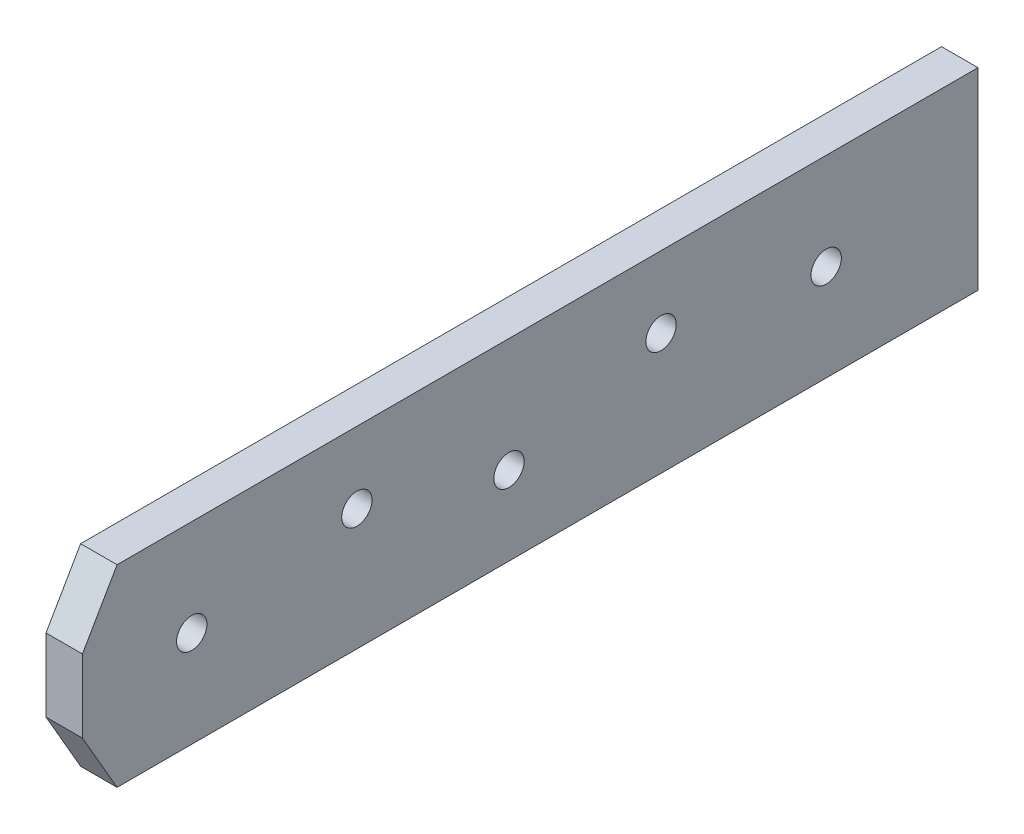
ISO-10303-21;
HEADER;
FILE_DESCRIPTION(('STEP AP214'),'2;1');
FILE_NAME('part.step','',(''),(''),'','','');
FILE_SCHEMA(('AUTOMOTIVE_DESIGN { 1 0 10303 214 1 1 1 1 }'));
ENDSEC;
DATA;
#1=APPLICATION_CONTEXT('core data for automotive mechanical design processes');
#2=APPLICATION_PROTOCOL_DEFINITION('international standard','automotive_design',2000,#1);
#3=PRODUCT_CONTEXT('',#1,'mechanical');
#4=PRODUCT('Part','Part','',(#3));
#5=PRODUCT_RELATED_PRODUCT_CATEGORY('part','',(#4));
#6=PRODUCT_DEFINITION_FORMATION('','',#4);
#7=PRODUCT_DEFINITION_CONTEXT('part definition',#1,'design');
#8=PRODUCT_DEFINITION('design','',#6,#7);
#9=PRODUCT_DEFINITION_SHAPE('','',#8);
#10=(LENGTH_UNIT() NAMED_UNIT(*) SI_UNIT(.MILLI.,.METRE.));
#11=(NAMED_UNIT(*) PLANE_ANGLE_UNIT() SI_UNIT($,.RADIAN.));
#12=(NAMED_UNIT(*) SI_UNIT($,.STERADIAN.) SOLID_ANGLE_UNIT());
#13=UNCERTAINTY_MEASURE_WITH_UNIT(LENGTH_MEASURE(1.E-05),#10,'distance_accuracy_value','');
#14=(GEOMETRIC_REPRESENTATION_CONTEXT(3) GLOBAL_UNCERTAINTY_ASSIGNED_CONTEXT((#13)) GLOBAL_UNIT_ASSIGNED_CONTEXT((#10,
#11,#12)) REPRESENTATION_CONTEXT('',''));
#15=CARTESIAN_POINT('',(0.,0.,0.));
#16=DIRECTION('',(0.,0.,1.));
#17=DIRECTION('',(1.,0.,0.));
#18=AXIS2_PLACEMENT_3D('',#15,#16,#17);
#19=CARTESIAN_POINT('',(6.,0.,0.));
#20=DIRECTION('',(-1.,0.,0.));
#21=DIRECTION('',(0.,0.,1.));
#22=AXIS2_PLACEMENT_3D('',#19,#20,#21);
#23=PLANE('',#22);
#24=DIRECTION('',(0.,-1.,0.));
#25=VECTOR('',#24,1.);
#26=CARTESIAN_POINT('',(6.,-3.125,70.228832959365));
#27=LINE('',#26,#25);
#28=CARTESIAN_POINT('',(6.,8.875,70.228832959365));
#29=VERTEX_POINT('',#28);
#30=CARTESIAN_POINT('',(6.,-3.125,70.228832959365));
#31=VERTEX_POINT('',#30);
#32=EDGE_CURVE('E129',#29,#31,#27,.T.);
#33=ORIENTED_EDGE('',*,*,#32,.T.);
#34=DIRECTION('',(0.,-0.86602540378444,-0.499999999999997));
#35=VECTOR('',#34,1.);
#36=CARTESIAN_POINT('',(6.,-13.,64.5274990511175));
#37=LINE('',#36,#35);
#38=CARTESIAN_POINT('',(6.,-13.,64.5274990511175));
#39=VERTEX_POINT('',#38);
#40=EDGE_CURVE('E87',#31,#39,#37,.T.);
#41=ORIENTED_EDGE('',*,*,#40,.T.);
#42=DIRECTION('',(0.,0.,-1.));
#43=VECTOR('',#42,1.);
#44=CARTESIAN_POINT('',(6.,-13.,-77.228832959365));
#45=LINE('',#44,#43);
#46=CARTESIAN_POINT('',(6.,-13.,-77.228832959365));
#47=VERTEX_POINT('',#46);
#48=EDGE_CURVE('E100',#39,#47,#45,.T.);
#49=ORIENTED_EDGE('',*,*,#48,.T.);
#50=DIRECTION('',(0.,1.,0.));
#51=VECTOR('',#50,1.);
#52=CARTESIAN_POINT('',(6.,18.75,-77.228832959365));
#53=LINE('',#52,#51);
#54=CARTESIAN_POINT('',(6.,18.75,-77.228832959365));
#55=VERTEX_POINT('',#54);
#56=EDGE_CURVE('E94',#47,#55,#53,.T.);
#57=ORIENTED_EDGE('',*,*,#56,.T.);
#58=DIRECTION('',(0.,0.,1.));
#59=VECTOR('',#58,1.);
#60=CARTESIAN_POINT('',(6.,18.75,64.5274990511175));
#61=LINE('',#60,#59);
#62=CARTESIAN_POINT('',(6.,18.75,64.5274990511175));
#63=VERTEX_POINT('',#62);
#64=EDGE_CURVE('E98',#55,#63,#61,.T.);
#65=ORIENTED_EDGE('',*,*,#64,.T.);
#66=DIRECTION('',(0.,-0.86602540378444,0.499999999999997));
#67=VECTOR('',#66,1.);
#68=CARTESIAN_POINT('',(6.,8.875,70.228832959365));
#69=LINE('',#68,#67);
#70=EDGE_CURVE('E50',#63,#29,#69,.T.);
#71=ORIENTED_EDGE('',*,*,#70,.T.);
#72=EDGE_LOOP('',(#33,#41,#49,#57,#65,#71));
#73=FACE_BOUND('',#72,.T.);
#74=CARTESIAN_POINT('',(6.,0.,0.));
#75=DIRECTION('',(1.,0.,0.));
#76=DIRECTION('',(0.,0.,-1.));
#77=AXIS2_PLACEMENT_3D('',#74,#75,#76);
#78=CIRCLE('',#77,2.5);
#79=CARTESIAN_POINT('',(6.,0.,-2.5));
#80=VERTEX_POINT('',#79);
#81=EDGE_CURVE('E122',#80,#80,#78,.T.);
#82=ORIENTED_EDGE('',*,*,#81,.F.);
#83=EDGE_LOOP('',(#82));
#84=FACE_BOUND('',#83,.T.);
#85=CARTESIAN_POINT('',(6.,7.,25.0399680510978));
#86=DIRECTION('',(1.,0.,0.));
#87=DIRECTION('',(0.,0.,-1.));
#88=AXIS2_PLACEMENT_3D('',#85,#86,#87);
#89=CIRCLE('',#88,2.5);
#90=CARTESIAN_POINT('',(6.,7.,22.5399680510978));
#91=VERTEX_POINT('',#90);
#92=EDGE_CURVE('E203',#91,#91,#89,.T.);
#93=ORIENTED_EDGE('',*,*,#92,.F.);
#94=EDGE_LOOP('',(#93));
#95=FACE_BOUND('',#94,.T.);
#96=CARTESIAN_POINT('',(6.,2.875,52.228832959365));
#97=DIRECTION('',(1.,0.,0.));
#98=DIRECTION('',(0.,0.,-1.));
#99=AXIS2_PLACEMENT_3D('',#96,#97,#98);
#100=CIRCLE('',#99,2.49999999999999);
#101=CARTESIAN_POINT('',(6.,2.875,49.728832959365));
#102=VERTEX_POINT('',#101);
#103=EDGE_CURVE('E197',#102,#102,#100,.T.);
#104=ORIENTED_EDGE('',*,*,#103,.F.);
#105=EDGE_LOOP('',(#104));
#106=FACE_BOUND('',#105,.T.);
#107=CARTESIAN_POINT('',(6.,2.875,-52.228832959365));
#108=DIRECTION('',(1.,0.,0.));
#109=DIRECTION('',(0.,0.,-1.));
#110=AXIS2_PLACEMENT_3D('',#107,#108,#109);
#111=CIRCLE('',#110,2.5);
#112=CARTESIAN_POINT('',(6.,2.875,-54.728832959365));
#113=VERTEX_POINT('',#112);
#114=EDGE_CURVE('E191',#113,#113,#111,.T.);
#115=ORIENTED_EDGE('',*,*,#114,.F.);
#116=EDGE_LOOP('',(#115));
#117=FACE_BOUND('',#116,.T.);
#118=CARTESIAN_POINT('',(6.,7.,-25.0399680510978));
#119=DIRECTION('',(1.,0.,0.));
#120=DIRECTION('',(0.,0.,-1.));
#121=AXIS2_PLACEMENT_3D('',#118,#119,#120);
#122=CIRCLE('',#121,2.50000000000001);
#123=CARTESIAN_POINT('',(6.,7.,-27.5399680510978));
#124=VERTEX_POINT('',#123);
#125=EDGE_CURVE('E182',#124,#124,#122,.T.);
#126=ORIENTED_EDGE('',*,*,#125,.F.);
#127=EDGE_LOOP('',(#126));
#128=FACE_BOUND('',#127,.T.);
#129=ADVANCED_FACE('F33',(#73,#84,#95,#106,#117,#128),#23,.F.);
#130=CARTESIAN_POINT('',(0.,0.,0.));
#131=DIRECTION('',(-1.,0.,0.));
#132=DIRECTION('',(0.,0.,1.));
#133=AXIS2_PLACEMENT_3D('',#130,#131,#132);
#134=PLANE('',#133);
#135=CARTESIAN_POINT('',(0.,2.875,-52.228832959365));
#136=DIRECTION('',(1.,0.,0.));
#137=DIRECTION('',(0.,0.,-1.));
#138=AXIS2_PLACEMENT_3D('',#135,#136,#137);
#139=CIRCLE('',#138,2.5);
#140=CARTESIAN_POINT('',(0.,2.875,-54.728832959365));
#141=VERTEX_POINT('',#140);
#142=EDGE_CURVE('E188',#141,#141,#139,.T.);
#143=ORIENTED_EDGE('',*,*,#142,.T.);
#144=EDGE_LOOP('',(#143));
#145=FACE_BOUND('',#144,.T.);
#146=CARTESIAN_POINT('',(0.,7.,25.0399680510978));
#147=DIRECTION('',(1.,0.,0.));
#148=DIRECTION('',(0.,0.,-1.));
#149=AXIS2_PLACEMENT_3D('',#146,#147,#148);
#150=CIRCLE('',#149,2.5);
#151=CARTESIAN_POINT('',(0.,7.,22.5399680510978));
#152=VERTEX_POINT('',#151);
#153=EDGE_CURVE('E200',#152,#152,#150,.T.);
#154=ORIENTED_EDGE('',*,*,#153,.T.);
#155=EDGE_LOOP('',(#154));
#156=FACE_BOUND('',#155,.T.);
#157=DIRECTION('',(0.,-1.,0.));
#158=VECTOR('',#157,1.);
#159=CARTESIAN_POINT('',(0.,-3.125,70.228832959365));
#160=LINE('',#159,#158);
#161=CARTESIAN_POINT('',(0.,8.875,70.228832959365));
#162=VERTEX_POINT('',#161);
#163=CARTESIAN_POINT('',(0.,-3.125,70.228832959365));
#164=VERTEX_POINT('',#163);
#165=EDGE_CURVE('E118',#162,#164,#160,.T.);
#166=ORIENTED_EDGE('',*,*,#165,.F.);
#167=DIRECTION('',(0.,-0.86602540378444,0.499999999999997));
#168=VECTOR('',#167,1.);
#169=CARTESIAN_POINT('',(0.,8.875,70.228832959365));
#170=LINE('',#169,#168);
#171=CARTESIAN_POINT('',(0.,18.75,64.5274990511175));
#172=VERTEX_POINT('',#171);
#173=EDGE_CURVE('E79',#172,#162,#170,.T.);
#174=ORIENTED_EDGE('',*,*,#173,.F.);
#175=DIRECTION('',(0.,0.,1.));
#176=VECTOR('',#175,1.);
#177=CARTESIAN_POINT('',(0.,18.75,64.5274990511175));
#178=LINE('',#177,#176);
#179=CARTESIAN_POINT('',(0.,18.75,-77.228832959365));
#180=VERTEX_POINT('',#179);
#181=EDGE_CURVE('E73',#180,#172,#178,.T.);
#182=ORIENTED_EDGE('',*,*,#181,.F.);
#183=DIRECTION('',(0.,1.,0.));
#184=VECTOR('',#183,1.);
#185=CARTESIAN_POINT('',(0.,18.75,-77.228832959365));
#186=LINE('',#185,#184);
#187=CARTESIAN_POINT('',(0.,-13.,-77.228832959365));
#188=VERTEX_POINT('',#187);
#189=EDGE_CURVE('E108',#188,#180,#186,.T.);
#190=ORIENTED_EDGE('',*,*,#189,.F.);
#191=DIRECTION('',(0.,0.,-1.));
#192=VECTOR('',#191,1.);
#193=CARTESIAN_POINT('',(0.,-13.,-77.228832959365));
#194=LINE('',#193,#192);
#195=CARTESIAN_POINT('',(0.,-13.,64.5274990511175));
#196=VERTEX_POINT('',#195);
#197=EDGE_CURVE('E124',#196,#188,#194,.T.);
#198=ORIENTED_EDGE('',*,*,#197,.F.);
#199=DIRECTION('',(0.,-0.86602540378444,-0.499999999999997));
#200=VECTOR('',#199,1.);
#201=CARTESIAN_POINT('',(0.,-13.,64.5274990511175));
#202=LINE('',#201,#200);
#203=EDGE_CURVE('E121',#164,#196,#202,.T.);
#204=ORIENTED_EDGE('',*,*,#203,.F.);
#205=EDGE_LOOP('',(#166,#174,#182,#190,#198,#204));
#206=FACE_BOUND('',#205,.T.);
#207=CARTESIAN_POINT('',(0.,0.,0.));
#208=DIRECTION('',(1.,0.,0.));
#209=DIRECTION('',(0.,0.,-1.));
#210=AXIS2_PLACEMENT_3D('',#207,#208,#209);
#211=CIRCLE('',#210,2.5);
#212=CARTESIAN_POINT('',(0.,0.,-2.5));
#213=VERTEX_POINT('',#212);
#214=EDGE_CURVE('E206',#213,#213,#211,.T.);
#215=ORIENTED_EDGE('',*,*,#214,.T.);
#216=EDGE_LOOP('',(#215));
#217=FACE_BOUND('',#216,.T.);
#218=CARTESIAN_POINT('',(0.,2.875,52.228832959365));
#219=DIRECTION('',(1.,0.,0.));
#220=DIRECTION('',(0.,0.,-1.));
#221=AXIS2_PLACEMENT_3D('',#218,#219,#220);
#222=CIRCLE('',#221,2.49999999999999);
#223=CARTESIAN_POINT('',(0.,2.875,49.728832959365));
#224=VERTEX_POINT('',#223);
#225=EDGE_CURVE('E194',#224,#224,#222,.T.);
#226=ORIENTED_EDGE('',*,*,#225,.T.);
#227=EDGE_LOOP('',(#226));
#228=FACE_BOUND('',#227,.T.);
#229=CARTESIAN_POINT('',(0.,7.,-25.0399680510978));
#230=DIRECTION('',(1.,0.,0.));
#231=DIRECTION('',(0.,0.,-1.));
#232=AXIS2_PLACEMENT_3D('',#229,#230,#231);
#233=CIRCLE('',#232,2.50000000000001);
#234=CARTESIAN_POINT('',(0.,7.,-27.5399680510978));
#235=VERTEX_POINT('',#234);
#236=EDGE_CURVE('E185',#235,#235,#233,.T.);
#237=ORIENTED_EDGE('',*,*,#236,.T.);
#238=EDGE_LOOP('',(#237));
#239=FACE_BOUND('',#238,.T.);
#240=ADVANCED_FACE('F138',(#145,#156,#206,#217,#228,#239),#134,.T.);
#241=CARTESIAN_POINT('',(6.,-3.125,70.228832959365));
#242=DIRECTION('',(0.,0.,-1.));
#243=DIRECTION('',(-1.,0.,0.));
#244=AXIS2_PLACEMENT_3D('',#241,#242,#243);
#245=PLANE('',#244);
#246=ORIENTED_EDGE('',*,*,#165,.T.);
#247=DIRECTION('',(-1.,0.,0.));
#248=VECTOR('',#247,1.);
#249=CARTESIAN_POINT('',(6.,-3.125,70.228832959365));
#250=LINE('',#249,#248);
#251=EDGE_CURVE('E11',#31,#164,#250,.T.);
#252=ORIENTED_EDGE('',*,*,#251,.F.);
#253=ORIENTED_EDGE('',*,*,#32,.F.);
#254=DIRECTION('',(-1.,0.,0.));
#255=VECTOR('',#254,1.);
#256=CARTESIAN_POINT('',(6.,8.875,70.228832959365));
#257=LINE('',#256,#255);
#258=EDGE_CURVE('E114',#29,#162,#257,.T.);
#259=ORIENTED_EDGE('',*,*,#258,.T.);
#260=EDGE_LOOP('',(#246,#252,#253,#259));
#261=FACE_BOUND('',#260,.T.);
#262=ADVANCED_FACE('F35',(#261),#245,.F.);
#263=CARTESIAN_POINT('',(6.,-13.,64.5274990511175));
#264=DIRECTION('',(0.,0.499999999999997,-0.86602540378444));
#265=DIRECTION('',(0.,0.86602540378444,0.499999999999997));
#266=AXIS2_PLACEMENT_3D('',#263,#264,#265);
#267=PLANE('',#266);
#268=ORIENTED_EDGE('',*,*,#203,.T.);
#269=DIRECTION('',(-1.,0.,0.));
#270=VECTOR('',#269,1.);
#271=CARTESIAN_POINT('',(6.,-13.,64.5274990511175));
#272=LINE('',#271,#270);
#273=EDGE_CURVE('E42',#39,#196,#272,.T.);
#274=ORIENTED_EDGE('',*,*,#273,.F.);
#275=ORIENTED_EDGE('',*,*,#40,.F.);
#276=ORIENTED_EDGE('',*,*,#251,.T.);
#277=EDGE_LOOP('',(#268,#274,#275,#276));
#278=FACE_BOUND('',#277,.T.);
#279=ADVANCED_FACE('F275',(#278),#267,.F.);
#280=CARTESIAN_POINT('',(6.,-13.,-77.228832959365));
#281=DIRECTION('',(0.,1.,0.));
#282=DIRECTION('',(0.,0.,1.));
#283=AXIS2_PLACEMENT_3D('',#280,#281,#282);
#284=PLANE('',#283);
#285=ORIENTED_EDGE('',*,*,#197,.T.);
#286=DIRECTION('',(-1.,0.,0.));
#287=VECTOR('',#286,1.);
#288=CARTESIAN_POINT('',(6.,-13.,-77.228832959365));
#289=LINE('',#288,#287);
#290=EDGE_CURVE('E109',#47,#188,#289,.T.);
#291=ORIENTED_EDGE('',*,*,#290,.F.);
#292=ORIENTED_EDGE('',*,*,#48,.F.);
#293=ORIENTED_EDGE('',*,*,#273,.T.);
#294=EDGE_LOOP('',(#285,#291,#292,#293));
#295=FACE_BOUND('',#294,.T.);
#296=ADVANCED_FACE('F135',(#295),#284,.F.);
#297=CARTESIAN_POINT('',(6.,18.75,-77.228832959365));
#298=DIRECTION('',(0.,0.,1.));
#299=DIRECTION('',(1.,0.,0.));
#300=AXIS2_PLACEMENT_3D('',#297,#298,#299);
#301=PLANE('',#300);
#302=ORIENTED_EDGE('',*,*,#189,.T.);
#303=DIRECTION('',(-1.,0.,0.));
#304=VECTOR('',#303,1.);
#305=CARTESIAN_POINT('',(6.,18.75,-77.228832959365));
#306=LINE('',#305,#304);
#307=EDGE_CURVE('E105',#55,#180,#306,.T.);
#308=ORIENTED_EDGE('',*,*,#307,.F.);
#309=ORIENTED_EDGE('',*,*,#56,.F.);
#310=ORIENTED_EDGE('',*,*,#290,.T.);
#311=EDGE_LOOP('',(#302,#308,#309,#310));
#312=FACE_BOUND('',#311,.T.);
#313=ADVANCED_FACE('F106',(#312),#301,.F.);
#314=CARTESIAN_POINT('',(6.,18.75,64.5274990511175));
#315=DIRECTION('',(0.,-1.,0.));
#316=DIRECTION('',(0.,0.,-1.));
#317=AXIS2_PLACEMENT_3D('',#314,#315,#316);
#318=PLANE('',#317);
#319=ORIENTED_EDGE('',*,*,#181,.T.);
#320=DIRECTION('',(-1.,0.,0.));
#321=VECTOR('',#320,1.);
#322=CARTESIAN_POINT('',(6.,18.75,64.5274990511175));
#323=LINE('',#322,#321);
#324=EDGE_CURVE('E110',#63,#172,#323,.T.);
#325=ORIENTED_EDGE('',*,*,#324,.F.);
#326=ORIENTED_EDGE('',*,*,#64,.F.);
#327=ORIENTED_EDGE('',*,*,#307,.T.);
#328=EDGE_LOOP('',(#319,#325,#326,#327));
#329=FACE_BOUND('',#328,.T.);
#330=ADVANCED_FACE('F112',(#329),#318,.F.);
#331=CARTESIAN_POINT('',(6.,8.875,70.228832959365));
#332=DIRECTION('',(0.,-0.499999999999997,-0.86602540378444));
#333=DIRECTION('',(0.,0.86602540378444,-0.499999999999997));
#334=AXIS2_PLACEMENT_3D('',#331,#332,#333);
#335=PLANE('',#334);
#336=ORIENTED_EDGE('',*,*,#173,.T.);
#337=ORIENTED_EDGE('',*,*,#258,.F.);
#338=ORIENTED_EDGE('',*,*,#70,.F.);
#339=ORIENTED_EDGE('',*,*,#324,.T.);
#340=EDGE_LOOP('',(#336,#337,#338,#339));
#341=FACE_BOUND('',#340,.T.);
#342=ADVANCED_FACE('F143',(#341),#335,.F.);
#343=CARTESIAN_POINT('',(6.,0.,0.));
#344=DIRECTION('',(-1.,0.,0.));
#345=DIRECTION('',(0.,0.,1.));
#346=AXIS2_PLACEMENT_3D('',#343,#344,#345);
#347=CYLINDRICAL_SURFACE('',#346,2.5);
#348=ORIENTED_EDGE('',*,*,#81,.T.);
#349=EDGE_LOOP('',(#348));
#350=FACE_BOUND('',#349,.T.);
#351=ORIENTED_EDGE('',*,*,#214,.F.);
#352=EDGE_LOOP('',(#351));
#353=FACE_BOUND('',#352,.T.);
#354=ADVANCED_FACE('F145',(#350,#353),#347,.F.);
#355=CARTESIAN_POINT('',(6.,7.,25.0399680510978));
#356=DIRECTION('',(-1.,0.,0.));
#357=DIRECTION('',(0.,0.,1.));
#358=AXIS2_PLACEMENT_3D('',#355,#356,#357);
#359=CYLINDRICAL_SURFACE('',#358,2.5);
#360=ORIENTED_EDGE('',*,*,#92,.T.);
#361=EDGE_LOOP('',(#360));
#362=FACE_BOUND('',#361,.T.);
#363=ORIENTED_EDGE('',*,*,#153,.F.);
#364=EDGE_LOOP('',(#363));
#365=FACE_BOUND('',#364,.T.);
#366=ADVANCED_FACE('F151',(#362,#365),#359,.F.);
#367=CARTESIAN_POINT('',(6.,2.875,52.228832959365));
#368=DIRECTION('',(-1.,0.,0.));
#369=DIRECTION('',(0.,0.,1.));
#370=AXIS2_PLACEMENT_3D('',#367,#368,#369);
#371=CYLINDRICAL_SURFACE('',#370,2.49999999999999);
#372=ORIENTED_EDGE('',*,*,#103,.T.);
#373=EDGE_LOOP('',(#372));
#374=FACE_BOUND('',#373,.T.);
#375=ORIENTED_EDGE('',*,*,#225,.F.);
#376=EDGE_LOOP('',(#375));
#377=FACE_BOUND('',#376,.T.);
#378=ADVANCED_FACE('F165',(#374,#377),#371,.F.);
#379=CARTESIAN_POINT('',(6.,2.875,-52.228832959365));
#380=DIRECTION('',(-1.,0.,0.));
#381=DIRECTION('',(0.,0.,1.));
#382=AXIS2_PLACEMENT_3D('',#379,#380,#381);
#383=CYLINDRICAL_SURFACE('',#382,2.5);
#384=ORIENTED_EDGE('',*,*,#114,.T.);
#385=EDGE_LOOP('',(#384));
#386=FACE_BOUND('',#385,.T.);
#387=ORIENTED_EDGE('',*,*,#142,.F.);
#388=EDGE_LOOP('',(#387));
#389=FACE_BOUND('',#388,.T.);
#390=ADVANCED_FACE('F169',(#386,#389),#383,.F.);
#391=CARTESIAN_POINT('',(6.,7.,-25.0399680510978));
#392=DIRECTION('',(-1.,0.,0.));
#393=DIRECTION('',(0.,0.,1.));
#394=AXIS2_PLACEMENT_3D('',#391,#392,#393);
#395=CYLINDRICAL_SURFACE('',#394,2.50000000000001);
#396=ORIENTED_EDGE('',*,*,#125,.T.);
#397=EDGE_LOOP('',(#396));
#398=FACE_BOUND('',#397,.T.);
#399=ORIENTED_EDGE('',*,*,#236,.F.);
#400=EDGE_LOOP('',(#399));
#401=FACE_BOUND('',#400,.T.);
#402=ADVANCED_FACE('F173',(#398,#401),#395,.F.);
#403=CLOSED_SHELL('',(#129,#240,#262,#279,#296,#313,#330,#342,#354,#366,#378,#390,#402));
#404=MANIFOLD_SOLID_BREP('B2',#403);
#405=ADVANCED_BREP_SHAPE_REPRESENTATION('',(#18,#404),#14);
#406=SHAPE_DEFINITION_REPRESENTATION(#9,#405);
ENDSEC;
END-ISO-10303-21;
